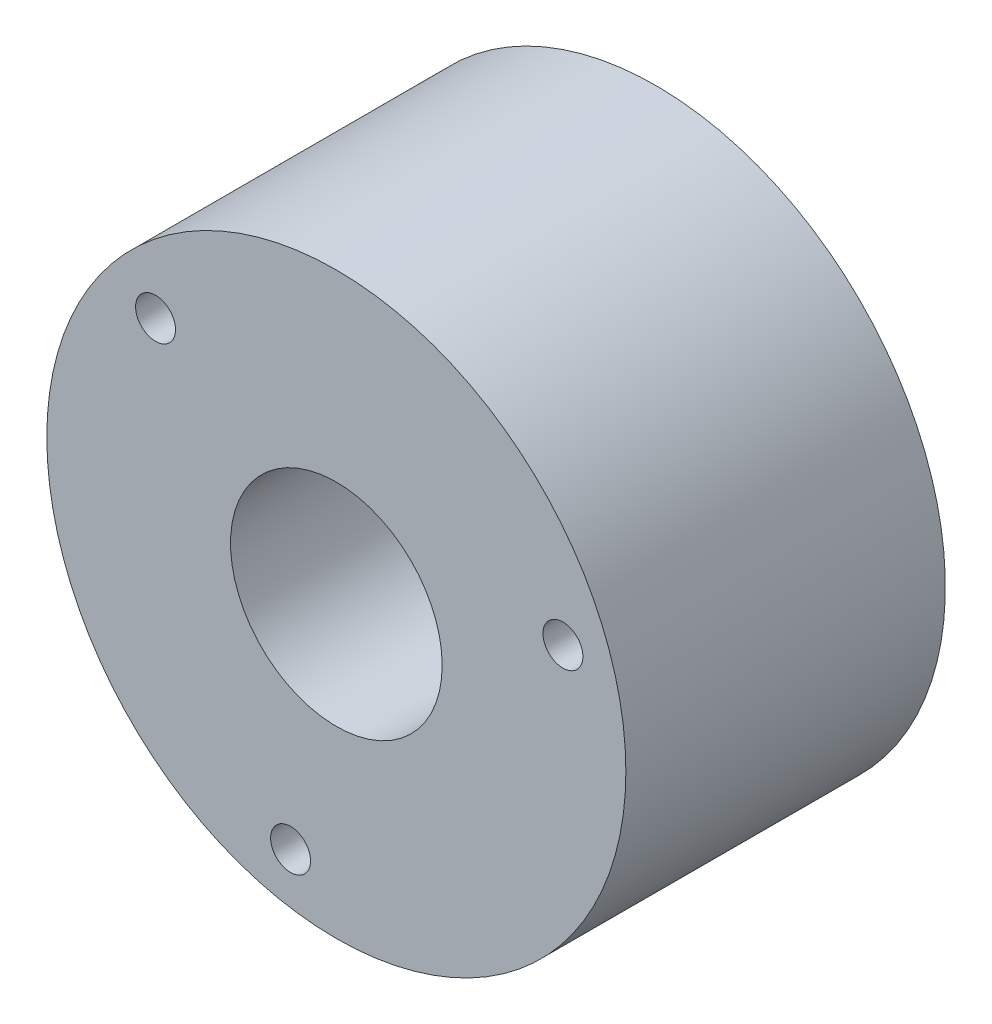
ISO-10303-21;
HEADER;
FILE_DESCRIPTION(('STEP AP214'),'2;1');
FILE_NAME('part.step','',(''),(''),'','','');
FILE_SCHEMA(('AUTOMOTIVE_DESIGN { 1 0 10303 214 1 1 1 1 }'));
ENDSEC;
DATA;
#1=APPLICATION_CONTEXT('core data for automotive mechanical design processes');
#2=APPLICATION_PROTOCOL_DEFINITION('international standard','automotive_design',2000,#1);
#3=PRODUCT_CONTEXT('',#1,'mechanical');
#4=PRODUCT('Part','Part','',(#3));
#5=PRODUCT_RELATED_PRODUCT_CATEGORY('part','',(#4));
#6=PRODUCT_DEFINITION_FORMATION('','',#4);
#7=PRODUCT_DEFINITION_CONTEXT('part definition',#1,'design');
#8=PRODUCT_DEFINITION('design','',#6,#7);
#9=PRODUCT_DEFINITION_SHAPE('','',#8);
#10=(LENGTH_UNIT() NAMED_UNIT(*) SI_UNIT(.MILLI.,.METRE.));
#11=(NAMED_UNIT(*) PLANE_ANGLE_UNIT() SI_UNIT($,.RADIAN.));
#12=(NAMED_UNIT(*) SI_UNIT($,.STERADIAN.) SOLID_ANGLE_UNIT());
#13=UNCERTAINTY_MEASURE_WITH_UNIT(LENGTH_MEASURE(1.E-05),#10,'distance_accuracy_value','');
#14=(GEOMETRIC_REPRESENTATION_CONTEXT(3) GLOBAL_UNCERTAINTY_ASSIGNED_CONTEXT((#13)) GLOBAL_UNIT_ASSIGNED_CONTEXT((#10,
#11,#12)) REPRESENTATION_CONTEXT('',''));
#15=CARTESIAN_POINT('',(0.,0.,0.));
#16=DIRECTION('',(0.,0.,1.));
#17=DIRECTION('',(1.,0.,0.));
#18=AXIS2_PLACEMENT_3D('',#15,#16,#17);
#19=CARTESIAN_POINT('',(0.,0.,20.));
#20=DIRECTION('',(0.,0.,1.));
#21=DIRECTION('',(1.,0.,0.));
#22=AXIS2_PLACEMENT_3D('',#19,#20,#21);
#23=PLANE('',#22);
#24=CARTESIAN_POINT('',(-5.73151575567018,-29.4474061190869,20.));
#25=DIRECTION('',(0.,0.,1.));
#26=DIRECTION('',(1.,0.,0.));
#27=AXIS2_PLACEMENT_3D('',#24,#25,#26);
#28=CIRCLE('',#27,2.50000000000086);
#29=CARTESIAN_POINT('',(-3.23151575566932,-29.4474061190869,20.));
#30=VERTEX_POINT('',#29);
#31=EDGE_CURVE('E71',#30,#30,#28,.T.);
#32=ORIENTED_EDGE('',*,*,#31,.F.);
#33=EDGE_LOOP('',(#32));
#34=FACE_BOUND('',#33,.T.);
#35=CARTESIAN_POINT('',(-22.6364438968532,19.687341306146,20.));
#36=DIRECTION('',(0.,0.,1.));
#37=DIRECTION('',(1.,0.,0.));
#38=AXIS2_PLACEMENT_3D('',#35,#36,#37);
#39=CIRCLE('',#38,2.50000000000225);
#40=CARTESIAN_POINT('',(-20.1364438968509,19.687341306146,20.));
#41=VERTEX_POINT('',#40);
#42=EDGE_CURVE('E65',#41,#41,#39,.T.);
#43=ORIENTED_EDGE('',*,*,#42,.F.);
#44=EDGE_LOOP('',(#43));
#45=FACE_BOUND('',#44,.T.);
#46=CARTESIAN_POINT('',(28.3679596525221,9.7600648129445,20.));
#47=DIRECTION('',(0.,0.,1.));
#48=DIRECTION('',(1.,0.,0.));
#49=AXIS2_PLACEMENT_3D('',#46,#47,#48);
#50=CIRCLE('',#49,2.50000000000001);
#51=CARTESIAN_POINT('',(30.8679596525221,9.7600648129445,20.));
#52=VERTEX_POINT('',#51);
#53=EDGE_CURVE('E59',#52,#52,#50,.T.);
#54=ORIENTED_EDGE('',*,*,#53,.F.);
#55=EDGE_LOOP('',(#54));
#56=FACE_BOUND('',#55,.T.);
#57=CARTESIAN_POINT('',(0.,0.,20.));
#58=DIRECTION('',(0.,0.,1.));
#59=DIRECTION('',(1.,0.,0.));
#60=AXIS2_PLACEMENT_3D('',#57,#58,#59);
#61=CIRCLE('',#60,36.25);
#62=CARTESIAN_POINT('',(36.25,0.,20.));
#63=VERTEX_POINT('',#62);
#64=EDGE_CURVE('E10',#63,#63,#61,.T.);
#65=ORIENTED_EDGE('',*,*,#64,.T.);
#66=EDGE_LOOP('',(#65));
#67=FACE_BOUND('',#66,.T.);
#68=CARTESIAN_POINT('',(0.,0.,20.));
#69=DIRECTION('',(0.,0.,1.));
#70=DIRECTION('',(1.,0.,0.));
#71=AXIS2_PLACEMENT_3D('',#68,#69,#70);
#72=CIRCLE('',#71,13.25);
#73=CARTESIAN_POINT('',(13.25,0.,20.));
#74=VERTEX_POINT('',#73);
#75=EDGE_CURVE('E39',#74,#74,#72,.T.);
#76=ORIENTED_EDGE('',*,*,#75,.F.);
#77=EDGE_LOOP('',(#76));
#78=FACE_BOUND('',#77,.T.);
#79=ADVANCED_FACE('F32',(#34,#45,#56,#67,#78),#23,.T.);
#80=CARTESIAN_POINT('',(0.,0.,20.));
#81=DIRECTION('',(0.,0.,-1.));
#82=DIRECTION('',(-1.,0.,0.));
#83=AXIS2_PLACEMENT_3D('',#80,#81,#82);
#84=CYLINDRICAL_SURFACE('',#83,36.25);
#85=ORIENTED_EDGE('',*,*,#64,.F.);
#86=EDGE_LOOP('',(#85));
#87=FACE_BOUND('',#86,.T.);
#88=CARTESIAN_POINT('',(0.,0.,-20.));
#89=DIRECTION('',(0.,0.,-1.));
#90=DIRECTION('',(-1.,0.,0.));
#91=AXIS2_PLACEMENT_3D('',#88,#89,#90);
#92=CIRCLE('',#91,36.25);
#93=CARTESIAN_POINT('',(-36.25,0.,-20.));
#94=VERTEX_POINT('',#93);
#95=EDGE_CURVE('E48',#94,#94,#92,.T.);
#96=ORIENTED_EDGE('',*,*,#95,.F.);
#97=EDGE_LOOP('',(#96));
#98=FACE_BOUND('',#97,.T.);
#99=ADVANCED_FACE('F34',(#87,#98),#84,.T.);
#100=CARTESIAN_POINT('',(0.,0.,20.));
#101=DIRECTION('',(0.,0.,-1.));
#102=DIRECTION('',(-1.,0.,0.));
#103=AXIS2_PLACEMENT_3D('',#100,#101,#102);
#104=CYLINDRICAL_SURFACE('',#103,13.25);
#105=ORIENTED_EDGE('',*,*,#75,.T.);
#106=EDGE_LOOP('',(#105));
#107=FACE_BOUND('',#106,.T.);
#108=CARTESIAN_POINT('',(0.,0.,0.));
#109=DIRECTION('',(0.,0.,1.));
#110=DIRECTION('',(1.,0.,0.));
#111=AXIS2_PLACEMENT_3D('',#108,#109,#110);
#112=CIRCLE('',#111,13.25);
#113=CARTESIAN_POINT('',(13.25,0.,0.));
#114=VERTEX_POINT('',#113);
#115=EDGE_CURVE('E43',#114,#114,#112,.T.);
#116=ORIENTED_EDGE('',*,*,#115,.F.);
#117=EDGE_LOOP('',(#116));
#118=FACE_BOUND('',#117,.T.);
#119=ADVANCED_FACE('F114',(#107,#118),#104,.F.);
#120=CARTESIAN_POINT('',(0.,0.,0.));
#121=DIRECTION('',(0.,0.,-1.));
#122=DIRECTION('',(-1.,0.,0.));
#123=AXIS2_PLACEMENT_3D('',#120,#121,#122);
#124=PLANE('',#123);
#125=CARTESIAN_POINT('',(0.,0.,0.));
#126=DIRECTION('',(0.,0.,-1.));
#127=DIRECTION('',(-1.,0.,0.));
#128=AXIS2_PLACEMENT_3D('',#125,#126,#127);
#129=CIRCLE('',#128,5.5);
#130=CARTESIAN_POINT('',(-5.5,0.,0.));
#131=VERTEX_POINT('',#130);
#132=EDGE_CURVE('E53',#131,#131,#129,.T.);
#133=ORIENTED_EDGE('',*,*,#132,.T.);
#134=EDGE_LOOP('',(#133));
#135=FACE_BOUND('',#134,.T.);
#136=ORIENTED_EDGE('',*,*,#115,.T.);
#137=EDGE_LOOP('',(#136));
#138=FACE_BOUND('',#137,.T.);
#139=ADVANCED_FACE('F111',(#135,#138),#124,.F.);
#140=CARTESIAN_POINT('',(0.,0.,-20.));
#141=DIRECTION('',(0.,0.,-1.));
#142=DIRECTION('',(-1.,0.,0.));
#143=AXIS2_PLACEMENT_3D('',#140,#141,#142);
#144=PLANE('',#143);
#145=CARTESIAN_POINT('',(-5.73151575567018,-29.4474061190869,-20.));
#146=DIRECTION('',(0.,0.,1.));
#147=DIRECTION('',(1.,0.,0.));
#148=AXIS2_PLACEMENT_3D('',#145,#146,#147);
#149=CIRCLE('',#148,2.50000000000086);
#150=CARTESIAN_POINT('',(-3.23151575566932,-29.4474061190869,-20.));
#151=VERTEX_POINT('',#150);
#152=EDGE_CURVE('E56',#151,#151,#149,.T.);
#153=ORIENTED_EDGE('',*,*,#152,.T.);
#154=EDGE_LOOP('',(#153));
#155=FACE_BOUND('',#154,.T.);
#156=CARTESIAN_POINT('',(-22.6364438968532,19.687341306146,-20.));
#157=DIRECTION('',(0.,0.,1.));
#158=DIRECTION('',(1.,0.,0.));
#159=AXIS2_PLACEMENT_3D('',#156,#157,#158);
#160=CIRCLE('',#159,2.50000000000225);
#161=CARTESIAN_POINT('',(-20.1364438968509,19.687341306146,-20.));
#162=VERTEX_POINT('',#161);
#163=EDGE_CURVE('E68',#162,#162,#160,.T.);
#164=ORIENTED_EDGE('',*,*,#163,.T.);
#165=EDGE_LOOP('',(#164));
#166=FACE_BOUND('',#165,.T.);
#167=CARTESIAN_POINT('',(28.3679596525221,9.7600648129445,-20.));
#168=DIRECTION('',(0.,0.,1.));
#169=DIRECTION('',(1.,0.,0.));
#170=AXIS2_PLACEMENT_3D('',#167,#168,#169);
#171=CIRCLE('',#170,2.50000000000001);
#172=CARTESIAN_POINT('',(30.8679596525221,9.7600648129445,-20.));
#173=VERTEX_POINT('',#172);
#174=EDGE_CURVE('E62',#173,#173,#171,.T.);
#175=ORIENTED_EDGE('',*,*,#174,.T.);
#176=EDGE_LOOP('',(#175));
#177=FACE_BOUND('',#176,.T.);
#178=ORIENTED_EDGE('',*,*,#95,.T.);
#179=EDGE_LOOP('',(#178));
#180=FACE_BOUND('',#179,.T.);
#181=CARTESIAN_POINT('',(0.,0.,-20.));
#182=DIRECTION('',(0.,0.,-1.));
#183=DIRECTION('',(-1.,0.,0.));
#184=AXIS2_PLACEMENT_3D('',#181,#182,#183);
#185=CIRCLE('',#184,5.5);
#186=CARTESIAN_POINT('',(-5.5,0.,-20.));
#187=VERTEX_POINT('',#186);
#188=EDGE_CURVE('E52',#187,#187,#185,.T.);
#189=ORIENTED_EDGE('',*,*,#188,.F.);
#190=EDGE_LOOP('',(#189));
#191=FACE_BOUND('',#190,.T.);
#192=ADVANCED_FACE('F77',(#155,#166,#177,#180,#191),#144,.T.);
#193=CARTESIAN_POINT('',(0.,0.,-20.));
#194=DIRECTION('',(0.,0.,1.));
#195=DIRECTION('',(1.,0.,0.));
#196=AXIS2_PLACEMENT_3D('',#193,#194,#195);
#197=CYLINDRICAL_SURFACE('',#196,5.5);
#198=ORIENTED_EDGE('',*,*,#188,.T.);
#199=EDGE_LOOP('',(#198));
#200=FACE_BOUND('',#199,.T.);
#201=ORIENTED_EDGE('',*,*,#132,.F.);
#202=EDGE_LOOP('',(#201));
#203=FACE_BOUND('',#202,.T.);
#204=ADVANCED_FACE('F96',(#200,#203),#197,.F.);
#205=CARTESIAN_POINT('',(28.3679596525221,9.7600648129445,-20.));
#206=DIRECTION('',(0.,0.,1.));
#207=DIRECTION('',(1.,0.,0.));
#208=AXIS2_PLACEMENT_3D('',#205,#206,#207);
#209=CYLINDRICAL_SURFACE('',#208,2.50000000000001);
#210=ORIENTED_EDGE('',*,*,#174,.F.);
#211=EDGE_LOOP('',(#210));
#212=FACE_BOUND('',#211,.T.);
#213=ORIENTED_EDGE('',*,*,#53,.T.);
#214=EDGE_LOOP('',(#213));
#215=FACE_BOUND('',#214,.T.);
#216=ADVANCED_FACE('F94',(#212,#215),#209,.F.);
#217=CARTESIAN_POINT('',(-22.6364438968532,19.687341306146,-20.));
#218=DIRECTION('',(0.,0.,1.));
#219=DIRECTION('',(1.,0.,0.));
#220=AXIS2_PLACEMENT_3D('',#217,#218,#219);
#221=CYLINDRICAL_SURFACE('',#220,2.50000000000225);
#222=ORIENTED_EDGE('',*,*,#163,.F.);
#223=EDGE_LOOP('',(#222));
#224=FACE_BOUND('',#223,.T.);
#225=ORIENTED_EDGE('',*,*,#42,.T.);
#226=EDGE_LOOP('',(#225));
#227=FACE_BOUND('',#226,.T.);
#228=ADVANCED_FACE('F83',(#224,#227),#221,.F.);
#229=CARTESIAN_POINT('',(-5.73151575567018,-29.4474061190869,-20.));
#230=DIRECTION('',(0.,0.,1.));
#231=DIRECTION('',(1.,0.,0.));
#232=AXIS2_PLACEMENT_3D('',#229,#230,#231);
#233=CYLINDRICAL_SURFACE('',#232,2.50000000000086);
#234=ORIENTED_EDGE('',*,*,#152,.F.);
#235=EDGE_LOOP('',(#234));
#236=FACE_BOUND('',#235,.T.);
#237=ORIENTED_EDGE('',*,*,#31,.T.);
#238=EDGE_LOOP('',(#237));
#239=FACE_BOUND('',#238,.T.);
#240=ADVANCED_FACE('F80',(#236,#239),#233,.F.);
#241=CLOSED_SHELL('',(#79,#99,#119,#139,#192,#204,#216,#228,#240));
#242=MANIFOLD_SOLID_BREP('B2',#241);
#243=ADVANCED_BREP_SHAPE_REPRESENTATION('',(#18,#242),#14);
#244=SHAPE_DEFINITION_REPRESENTATION(#9,#243);
ENDSEC;
END-ISO-10303-21;
